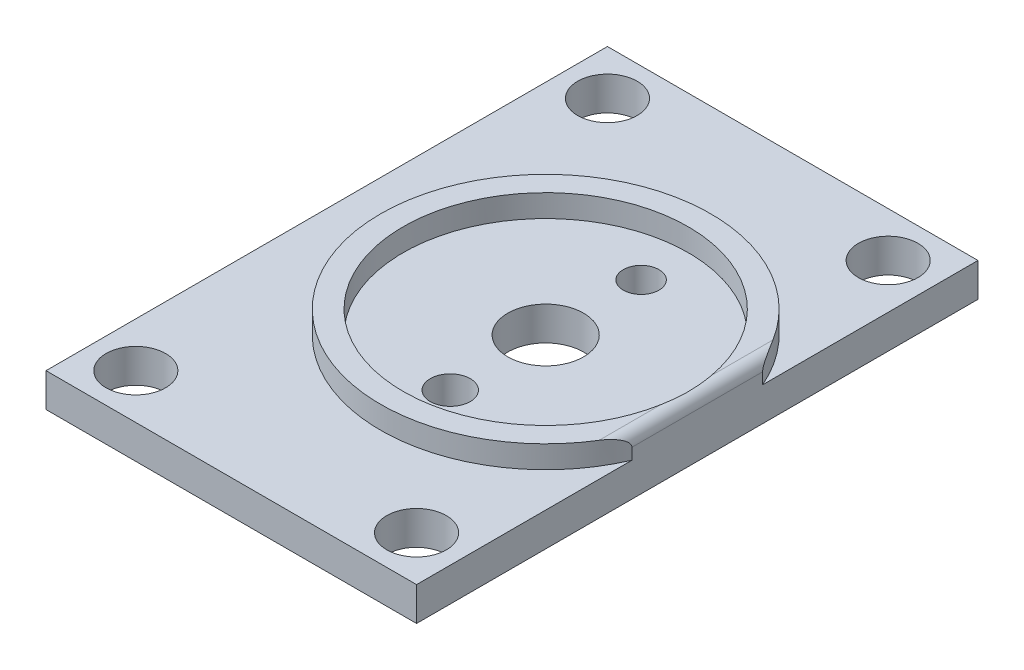
ISO-10303-21;
HEADER;
FILE_DESCRIPTION(('STEP AP214'),'2;1');
FILE_NAME('part.step','',(''),(''),'','','');
FILE_SCHEMA(('AUTOMOTIVE_DESIGN { 1 0 10303 214 1 1 1 1 }'));
ENDSEC;
DATA;
#1=APPLICATION_CONTEXT('core data for automotive mechanical design processes');
#2=APPLICATION_PROTOCOL_DEFINITION('international standard','automotive_design',2000,#1);
#3=PRODUCT_CONTEXT('',#1,'mechanical');
#4=PRODUCT('Part','Part','',(#3));
#5=PRODUCT_RELATED_PRODUCT_CATEGORY('part','',(#4));
#6=PRODUCT_DEFINITION_FORMATION('','',#4);
#7=PRODUCT_DEFINITION_CONTEXT('part definition',#1,'design');
#8=PRODUCT_DEFINITION('design','',#6,#7);
#9=PRODUCT_DEFINITION_SHAPE('','',#8);
#10=(LENGTH_UNIT() NAMED_UNIT(*) SI_UNIT(.MILLI.,.METRE.));
#11=(NAMED_UNIT(*) PLANE_ANGLE_UNIT() SI_UNIT($,.RADIAN.));
#12=(NAMED_UNIT(*) SI_UNIT($,.STERADIAN.) SOLID_ANGLE_UNIT());
#13=UNCERTAINTY_MEASURE_WITH_UNIT(LENGTH_MEASURE(1.E-05),#10,'distance_accuracy_value','');
#14=(GEOMETRIC_REPRESENTATION_CONTEXT(3) GLOBAL_UNCERTAINTY_ASSIGNED_CONTEXT((#13)) GLOBAL_UNIT_ASSIGNED_CONTEXT((#10,
#11,#12)) REPRESENTATION_CONTEXT('',''));
#15=CARTESIAN_POINT('',(0.,0.,0.));
#16=DIRECTION('',(0.,0.,1.));
#17=DIRECTION('',(1.,0.,0.));
#18=AXIS2_PLACEMENT_3D('',#15,#16,#17);
#19=CARTESIAN_POINT('',(0.,3.,0.));
#20=DIRECTION('',(0.,1.,0.));
#21=DIRECTION('',(0.,0.,1.));
#22=AXIS2_PLACEMENT_3D('',#19,#20,#21);
#23=PLANE('',#22);
#24=CARTESIAN_POINT('',(1.27695167286245,3.,-19.8847583643123));
#25=DIRECTION('',(0.,1.,0.));
#26=DIRECTION('',(0.,0.,1.));
#27=AXIS2_PLACEMENT_3D('',#24,#25,#26);
#28=CIRCLE('',#27,1.58978016760219);
#29=CARTESIAN_POINT('',(1.27695167286245,3.,-18.2949781967101));
#30=VERTEX_POINT('',#29);
#31=EDGE_CURVE('E253',#30,#30,#28,.T.);
#32=ORIENTED_EDGE('',*,*,#31,.F.);
#33=EDGE_LOOP('',(#32));
#34=FACE_BOUND('',#33,.T.);
#35=CARTESIAN_POINT('',(1.27695167286245,3.,-2.88475836431227));
#36=DIRECTION('',(0.,1.,0.));
#37=DIRECTION('',(0.,0.,1.));
#38=AXIS2_PLACEMENT_3D('',#35,#36,#37);
#39=CIRCLE('',#38,1.77742826201975);
#40=CARTESIAN_POINT('',(1.27695167286245,3.,-1.10733010229252));
#41=VERTEX_POINT('',#40);
#42=EDGE_CURVE('E257',#41,#41,#39,.T.);
#43=ORIENTED_EDGE('',*,*,#42,.F.);
#44=EDGE_LOOP('',(#43));
#45=FACE_BOUND('',#44,.T.);
#46=CARTESIAN_POINT('',(1.27695167286245,3.,-11.3847583643123));
#47=DIRECTION('',(0.,1.,0.));
#48=DIRECTION('',(0.,0.,1.));
#49=AXIS2_PLACEMENT_3D('',#46,#47,#48);
#50=CIRCLE('',#49,3.375);
#51=CARTESIAN_POINT('',(1.27695167286245,3.,-8.00975836431227));
#52=VERTEX_POINT('',#51);
#53=EDGE_CURVE('E151',#52,#52,#50,.T.);
#54=ORIENTED_EDGE('',*,*,#53,.F.);
#55=EDGE_LOOP('',(#54));
#56=FACE_BOUND('',#55,.T.);
#57=CARTESIAN_POINT('',(1.27695167286245,3.,-11.3847583643123));
#58=DIRECTION('',(0.,1.,0.));
#59=DIRECTION('',(0.,0.,1.));
#60=AXIS2_PLACEMENT_3D('',#57,#58,#59);
#61=CIRCLE('',#60,12.7);
#62=CARTESIAN_POINT('',(1.27695167286245,3.,1.31524163568773));
#63=VERTEX_POINT('',#62);
#64=EDGE_CURVE('E262',#63,#63,#61,.T.);
#65=ORIENTED_EDGE('',*,*,#64,.T.);
#66=EDGE_LOOP('',(#65));
#67=FACE_BOUND('',#66,.T.);
#68=ADVANCED_FACE('F41',(#34,#45,#56,#67),#23,.T.);
#69=CARTESIAN_POINT('',(0.,0.,0.));
#70=DIRECTION('',(0.,1.,0.));
#71=DIRECTION('',(0.,0.,1.));
#72=AXIS2_PLACEMENT_3D('',#69,#70,#71);
#73=PLANE('',#72);
#74=CARTESIAN_POINT('',(1.27695167286245,0.,-19.8847583643123));
#75=DIRECTION('',(0.,1.,0.));
#76=DIRECTION('',(0.,0.,1.));
#77=AXIS2_PLACEMENT_3D('',#74,#75,#76);
#78=CIRCLE('',#77,1.58978016760219);
#79=CARTESIAN_POINT('',(1.27695167286245,0.,-18.2949781967101));
#80=VERTEX_POINT('',#79);
#81=EDGE_CURVE('E266',#80,#80,#78,.T.);
#82=ORIENTED_EDGE('',*,*,#81,.T.);
#83=EDGE_LOOP('',(#82));
#84=FACE_BOUND('',#83,.T.);
#85=CARTESIAN_POINT('',(1.27695167286245,0.,-2.88475836431227));
#86=DIRECTION('',(0.,1.,0.));
#87=DIRECTION('',(0.,0.,1.));
#88=AXIS2_PLACEMENT_3D('',#85,#86,#87);
#89=CIRCLE('',#88,1.77742826201975);
#90=CARTESIAN_POINT('',(1.27695167286245,0.,-1.10733010229252));
#91=VERTEX_POINT('',#90);
#92=EDGE_CURVE('E274',#91,#91,#89,.T.);
#93=ORIENTED_EDGE('',*,*,#92,.T.);
#94=EDGE_LOOP('',(#93));
#95=FACE_BOUND('',#94,.T.);
#96=CARTESIAN_POINT('',(10.7769516728624,0.,-32.3847583643123));
#97=DIRECTION('',(0.,1.,0.));
#98=DIRECTION('',(0.,0.,1.));
#99=AXIS2_PLACEMENT_3D('',#96,#97,#98);
#100=CIRCLE('',#99,2.65);
#101=CARTESIAN_POINT('',(10.7769516728624,0.,-29.7347583643123));
#102=VERTEX_POINT('',#101);
#103=EDGE_CURVE('E297',#102,#102,#100,.F.);
#104=ORIENTED_EDGE('',*,*,#103,.F.);
#105=EDGE_LOOP('',(#104));
#106=FACE_BOUND('',#105,.T.);
#107=CARTESIAN_POINT('',(10.7769516728625,0.,9.61524163568773));
#108=DIRECTION('',(0.,1.,0.));
#109=DIRECTION('',(0.,0.,1.));
#110=AXIS2_PLACEMENT_3D('',#107,#108,#109);
#111=CIRCLE('',#110,2.65);
#112=CARTESIAN_POINT('',(10.7769516728625,0.,12.2652416356877));
#113=VERTEX_POINT('',#112);
#114=EDGE_CURVE('E290',#113,#113,#111,.F.);
#115=ORIENTED_EDGE('',*,*,#114,.F.);
#116=EDGE_LOOP('',(#115));
#117=FACE_BOUND('',#116,.T.);
#118=CARTESIAN_POINT('',(1.27695167286245,0.,-11.3847583643123));
#119=DIRECTION('',(0.,1.,0.));
#120=DIRECTION('',(0.,0.,1.));
#121=AXIS2_PLACEMENT_3D('',#118,#119,#120);
#122=CIRCLE('',#121,3.375);
#123=CARTESIAN_POINT('',(1.27695167286245,0.,-8.00975836431227));
#124=VERTEX_POINT('',#123);
#125=EDGE_CURVE('E150',#124,#124,#122,.T.);
#126=ORIENTED_EDGE('',*,*,#125,.T.);
#127=EDGE_LOOP('',(#126));
#128=FACE_BOUND('',#127,.T.);
#129=DIRECTION('',(1.,0.,0.));
#130=VECTOR('',#129,1.);
#131=CARTESIAN_POINT('',(-10.2230483271375,0.,13.6152416356877));
#132=LINE('',#131,#130);
#133=CARTESIAN_POINT('',(-18.2230483271375,0.,13.6152416356877));
#134=VERTEX_POINT('',#133);
#135=CARTESIAN_POINT('',(14.7769516728625,0.,13.6152416356877));
#136=VERTEX_POINT('',#135);
#137=EDGE_CURVE('E127',#134,#136,#132,.T.);
#138=ORIENTED_EDGE('',*,*,#137,.F.);
#139=DIRECTION('',(0.,0.,1.));
#140=VECTOR('',#139,1.);
#141=CARTESIAN_POINT('',(-18.2230483271375,0.,-36.3847583643123));
#142=LINE('',#141,#140);
#143=CARTESIAN_POINT('',(-18.2230483271375,0.,-36.3847583643123));
#144=VERTEX_POINT('',#143);
#145=EDGE_CURVE('E124',#144,#134,#142,.T.);
#146=ORIENTED_EDGE('',*,*,#145,.F.);
#147=DIRECTION('',(-1.,0.,0.));
#148=VECTOR('',#147,1.);
#149=CARTESIAN_POINT('',(-10.2230483271376,0.,-36.3847583643123));
#150=LINE('',#149,#148);
#151=CARTESIAN_POINT('',(14.7769516728625,0.,-36.3847583643123));
#152=VERTEX_POINT('',#151);
#153=EDGE_CURVE('E109',#152,#144,#150,.T.);
#154=ORIENTED_EDGE('',*,*,#153,.F.);
#155=DIRECTION('',(0.,0.,-1.));
#156=VECTOR('',#155,1.);
#157=CARTESIAN_POINT('',(14.7769516728625,0.,-36.3847583643123));
#158=LINE('',#157,#156);
#159=EDGE_CURVE('E121',#136,#152,#158,.T.);
#160=ORIENTED_EDGE('',*,*,#159,.F.);
#161=EDGE_LOOP('',(#138,#146,#154,#160));
#162=FACE_BOUND('',#161,.T.);
#163=CARTESIAN_POINT('',(-14.2230483271375,0.,-32.3847583643123));
#164=DIRECTION('',(0.,1.,0.));
#165=DIRECTION('',(0.,0.,1.));
#166=AXIS2_PLACEMENT_3D('',#163,#164,#165);
#167=CIRCLE('',#166,2.65);
#168=CARTESIAN_POINT('',(-14.2230483271375,0.,-29.7347583643123));
#169=VERTEX_POINT('',#168);
#170=EDGE_CURVE('E46',#169,#169,#167,.F.);
#171=ORIENTED_EDGE('',*,*,#170,.F.);
#172=EDGE_LOOP('',(#171));
#173=FACE_BOUND('',#172,.T.);
#174=CARTESIAN_POINT('',(-14.2230483271375,0.,9.61524163568773));
#175=DIRECTION('',(0.,1.,0.));
#176=DIRECTION('',(0.,0.,1.));
#177=AXIS2_PLACEMENT_3D('',#174,#175,#176);
#178=CIRCLE('',#177,2.65);
#179=CARTESIAN_POINT('',(-14.2230483271375,0.,12.2652416356877));
#180=VERTEX_POINT('',#179);
#181=EDGE_CURVE('E322',#180,#180,#178,.F.);
#182=ORIENTED_EDGE('',*,*,#181,.F.);
#183=EDGE_LOOP('',(#182));
#184=FACE_BOUND('',#183,.T.);
#185=ADVANCED_FACE('F125',(#84,#95,#106,#117,#128,#162,#173,#184),#73,.F.);
#186=CARTESIAN_POINT('',(1.27695167286245,3.,-11.3847583643123));
#187=DIRECTION('',(0.,1.,0.));
#188=DIRECTION('',(0.,0.,1.));
#189=AXIS2_PLACEMENT_3D('',#186,#187,#188);
#190=CIRCLE('',#189,14.7);
#191=CARTESIAN_POINT('',(14.7769516728625,3.,-17.2019741932119));
#192=VERTEX_POINT('',#191);
#193=CARTESIAN_POINT('',(14.7769516728625,3.,-5.56754253541269));
#194=VERTEX_POINT('',#193);
#195=EDGE_CURVE('E265',#192,#194,#190,.T.);
#196=ORIENTED_EDGE('',*,*,#195,.F.);
#197=DIRECTION('',(0.,0.,-1.));
#198=VECTOR('',#197,1.);
#199=CARTESIAN_POINT('',(14.7769516728625,3.,-36.3847583643123));
#200=LINE('',#199,#198);
#201=CARTESIAN_POINT('',(14.7769516728625,3.,-36.3847583643123));
#202=VERTEX_POINT('',#201);
#203=EDGE_CURVE('E160',#192,#202,#200,.T.);
#204=ORIENTED_EDGE('',*,*,#203,.T.);
#205=DIRECTION('',(-1.,0.,0.));
#206=VECTOR('',#205,1.);
#207=CARTESIAN_POINT('',(-10.2230483271376,3.,-36.3847583643123));
#208=LINE('',#207,#206);
#209=CARTESIAN_POINT('',(-18.2230483271376,3.,-36.3847583643123));
#210=VERTEX_POINT('',#209);
#211=EDGE_CURVE('E165',#202,#210,#208,.T.);
#212=ORIENTED_EDGE('',*,*,#211,.T.);
#213=DIRECTION('',(0.,0.,-1.));
#214=VECTOR('',#213,1.);
#215=CARTESIAN_POINT('',(-18.2230483271376,3.,-36.3847583643123));
#216=LINE('',#215,#214);
#217=CARTESIAN_POINT('',(-18.2230483271375,3.,13.6152416356877));
#218=VERTEX_POINT('',#217);
#219=EDGE_CURVE('E135',#218,#210,#216,.T.);
#220=ORIENTED_EDGE('',*,*,#219,.F.);
#221=DIRECTION('',(1.,0.,0.));
#222=VECTOR('',#221,1.);
#223=CARTESIAN_POINT('',(-10.2230483271375,3.,13.6152416356877));
#224=LINE('',#223,#222);
#225=CARTESIAN_POINT('',(14.7769516728625,3.,13.6152416356877));
#226=VERTEX_POINT('',#225);
#227=EDGE_CURVE('E120',#218,#226,#224,.T.);
#228=ORIENTED_EDGE('',*,*,#227,.T.);
#229=EDGE_CURVE('E161',#226,#194,#200,.T.);
#230=ORIENTED_EDGE('',*,*,#229,.T.);
#231=EDGE_LOOP('',(#196,#204,#212,#220,#228,#230));
#232=FACE_BOUND('',#231,.T.);
#233=CARTESIAN_POINT('',(10.7769516728624,3.,-32.3847583643123));
#234=DIRECTION('',(0.,-1.,0.));
#235=DIRECTION('',(0.,0.,1.));
#236=AXIS2_PLACEMENT_3D('',#233,#234,#235);
#237=CIRCLE('',#236,2.65);
#238=CARTESIAN_POINT('',(10.7769516728624,3.,-29.7347583643123));
#239=VERTEX_POINT('',#238);
#240=EDGE_CURVE('E286',#239,#239,#237,.T.);
#241=ORIENTED_EDGE('',*,*,#240,.T.);
#242=EDGE_LOOP('',(#241));
#243=FACE_BOUND('',#242,.T.);
#244=CARTESIAN_POINT('',(10.7769516728625,3.,9.61524163568773));
#245=DIRECTION('',(0.,-1.,0.));
#246=DIRECTION('',(0.,0.,1.));
#247=AXIS2_PLACEMENT_3D('',#244,#245,#246);
#248=CIRCLE('',#247,2.65);
#249=CARTESIAN_POINT('',(10.7769516728625,3.,12.2652416356877));
#250=VERTEX_POINT('',#249);
#251=EDGE_CURVE('E285',#250,#250,#248,.T.);
#252=ORIENTED_EDGE('',*,*,#251,.T.);
#253=EDGE_LOOP('',(#252));
#254=FACE_BOUND('',#253,.T.);
#255=CARTESIAN_POINT('',(-14.2230483271375,3.,-32.3847583643123));
#256=DIRECTION('',(0.,1.,0.));
#257=DIRECTION('',(0.,0.,1.));
#258=AXIS2_PLACEMENT_3D('',#255,#256,#257);
#259=CIRCLE('',#258,2.65);
#260=CARTESIAN_POINT('',(-14.2230483271375,3.,-29.7347583643123));
#261=VERTEX_POINT('',#260);
#262=EDGE_CURVE('E138',#261,#261,#259,.T.);
#263=ORIENTED_EDGE('',*,*,#262,.F.);
#264=EDGE_LOOP('',(#263));
#265=FACE_BOUND('',#264,.T.);
#266=CARTESIAN_POINT('',(-14.2230483271375,3.,9.61524163568773));
#267=DIRECTION('',(0.,1.,0.));
#268=DIRECTION('',(0.,0.,1.));
#269=AXIS2_PLACEMENT_3D('',#266,#267,#268);
#270=CIRCLE('',#269,2.65);
#271=CARTESIAN_POINT('',(-14.2230483271375,3.,12.2652416356877));
#272=VERTEX_POINT('',#271);
#273=EDGE_CURVE('E144',#272,#272,#270,.T.);
#274=ORIENTED_EDGE('',*,*,#273,.F.);
#275=EDGE_LOOP('',(#274));
#276=FACE_BOUND('',#275,.T.);
#277=ADVANCED_FACE('F230',(#232,#243,#254,#265,#276),#23,.T.);
#278=CARTESIAN_POINT('',(-10.2230483271375,3.,13.6152416356877));
#279=DIRECTION('',(0.,0.,-1.));
#280=DIRECTION('',(-1.,0.,0.));
#281=AXIS2_PLACEMENT_3D('',#278,#279,#280);
#282=PLANE('',#281);
#283=DIRECTION('',(0.,1.,0.));
#284=VECTOR('',#283,1.);
#285=CARTESIAN_POINT('',(-18.2230483271375,3.,13.6152416356877));
#286=LINE('',#285,#284);
#287=EDGE_CURVE('E137',#134,#218,#286,.T.);
#288=ORIENTED_EDGE('',*,*,#287,.F.);
#289=ORIENTED_EDGE('',*,*,#137,.T.);
#290=DIRECTION('',(0.,-1.,0.));
#291=VECTOR('',#290,1.);
#292=CARTESIAN_POINT('',(14.7769516728625,3.,13.6152416356877));
#293=LINE('',#292,#291);
#294=EDGE_CURVE('E174',#226,#136,#293,.T.);
#295=ORIENTED_EDGE('',*,*,#294,.F.);
#296=ORIENTED_EDGE('',*,*,#227,.F.);
#297=EDGE_LOOP('',(#288,#289,#295,#296));
#298=FACE_BOUND('',#297,.T.);
#299=ADVANCED_FACE('F233',(#298),#282,.F.);
#300=CARTESIAN_POINT('',(14.7769516728625,3.,-36.3847583643123));
#301=DIRECTION('',(-1.,0.,0.));
#302=DIRECTION('',(0.,0.,1.));
#303=AXIS2_PLACEMENT_3D('',#300,#301,#302);
#304=PLANE('',#303);
#305=DIRECTION('',(0.,-1.,0.));
#306=VECTOR('',#305,1.);
#307=CARTESIAN_POINT('',(14.7769516728625,5.,-17.2019741932119));
#308=LINE('',#307,#306);
#309=CARTESIAN_POINT('',(14.7769516728625,4.,-17.2019741932119));
#310=VERTEX_POINT('',#309);
#311=EDGE_CURVE('E282',#310,#192,#308,.T.);
#312=ORIENTED_EDGE('',*,*,#311,.F.);
#313=DIRECTION('',(0.,0.,-1.));
#314=VECTOR('',#313,1.);
#315=CARTESIAN_POINT('',(14.7769516728625,4.,-5.56754253541269));
#316=LINE('',#315,#314);
#317=CARTESIAN_POINT('',(14.7769516728625,4.,-5.56754253541269));
#318=VERTEX_POINT('',#317);
#319=EDGE_CURVE('E11',#310,#318,#316,.F.);
#320=ORIENTED_EDGE('',*,*,#319,.T.);
#321=DIRECTION('',(0.,-1.,0.));
#322=VECTOR('',#321,1.);
#323=CARTESIAN_POINT('',(14.7769516728625,5.,-5.56754253541269));
#324=LINE('',#323,#322);
#325=EDGE_CURVE('E279',#318,#194,#324,.T.);
#326=ORIENTED_EDGE('',*,*,#325,.T.);
#327=ORIENTED_EDGE('',*,*,#229,.F.);
#328=ORIENTED_EDGE('',*,*,#294,.T.);
#329=ORIENTED_EDGE('',*,*,#159,.T.);
#330=DIRECTION('',(0.,-1.,0.));
#331=VECTOR('',#330,1.);
#332=CARTESIAN_POINT('',(14.7769516728625,3.,-36.3847583643123));
#333=LINE('',#332,#331);
#334=EDGE_CURVE('E116',#202,#152,#333,.T.);
#335=ORIENTED_EDGE('',*,*,#334,.F.);
#336=ORIENTED_EDGE('',*,*,#203,.F.);
#337=EDGE_LOOP('',(#312,#320,#326,#327,#328,#329,#335,#336));
#338=FACE_BOUND('',#337,.T.);
#339=ADVANCED_FACE('F240',(#338),#304,.F.);
#340=CARTESIAN_POINT('',(-10.2230483271376,3.,-36.3847583643123));
#341=DIRECTION('',(0.,0.,1.));
#342=DIRECTION('',(1.,0.,0.));
#343=AXIS2_PLACEMENT_3D('',#340,#341,#342);
#344=PLANE('',#343);
#345=ORIENTED_EDGE('',*,*,#153,.T.);
#346=DIRECTION('',(0.,-1.,0.));
#347=VECTOR('',#346,1.);
#348=CARTESIAN_POINT('',(-18.2230483271376,3.,-36.3847583643123));
#349=LINE('',#348,#347);
#350=EDGE_CURVE('E114',#210,#144,#349,.T.);
#351=ORIENTED_EDGE('',*,*,#350,.F.);
#352=ORIENTED_EDGE('',*,*,#211,.F.);
#353=ORIENTED_EDGE('',*,*,#334,.T.);
#354=EDGE_LOOP('',(#345,#351,#352,#353));
#355=FACE_BOUND('',#354,.T.);
#356=ADVANCED_FACE('F111',(#355),#344,.F.);
#357=CARTESIAN_POINT('',(1.27695167286245,3.,-11.3847583643123));
#358=DIRECTION('',(0.,-1.,0.));
#359=DIRECTION('',(0.,0.,-1.));
#360=AXIS2_PLACEMENT_3D('',#357,#358,#359);
#361=CYLINDRICAL_SURFACE('',#360,3.375);
#362=ORIENTED_EDGE('',*,*,#53,.T.);
#363=EDGE_LOOP('',(#362));
#364=FACE_BOUND('',#363,.T.);
#365=ORIENTED_EDGE('',*,*,#125,.F.);
#366=EDGE_LOOP('',(#365));
#367=FACE_BOUND('',#366,.T.);
#368=ADVANCED_FACE('F226',(#364,#367),#361,.F.);
#369=CARTESIAN_POINT('',(-18.2230483271375,0.,0.));
#370=DIRECTION('',(-1.,0.,0.));
#371=DIRECTION('',(0.,0.,1.));
#372=AXIS2_PLACEMENT_3D('',#369,#370,#371);
#373=PLANE('',#372);
#374=ORIENTED_EDGE('',*,*,#145,.T.);
#375=ORIENTED_EDGE('',*,*,#287,.T.);
#376=ORIENTED_EDGE('',*,*,#219,.T.);
#377=ORIENTED_EDGE('',*,*,#350,.T.);
#378=EDGE_LOOP('',(#374,#375,#376,#377));
#379=FACE_BOUND('',#378,.T.);
#380=ADVANCED_FACE('F133',(#379),#373,.T.);
#381=CARTESIAN_POINT('',(-14.2230483271375,-0.3,9.61524163568773));
#382=DIRECTION('',(0.,1.,0.));
#383=DIRECTION('',(0.,0.,1.));
#384=AXIS2_PLACEMENT_3D('',#381,#382,#383);
#385=CYLINDRICAL_SURFACE('',#384,2.65);
#386=ORIENTED_EDGE('',*,*,#181,.T.);
#387=EDGE_LOOP('',(#386));
#388=FACE_BOUND('',#387,.T.);
#389=ORIENTED_EDGE('',*,*,#273,.T.);
#390=EDGE_LOOP('',(#389));
#391=FACE_BOUND('',#390,.T.);
#392=ADVANCED_FACE('F219',(#388,#391),#385,.F.);
#393=CARTESIAN_POINT('',(-14.2230483271375,-0.3,-32.3847583643123));
#394=DIRECTION('',(0.,1.,0.));
#395=DIRECTION('',(0.,0.,1.));
#396=AXIS2_PLACEMENT_3D('',#393,#394,#395);
#397=CYLINDRICAL_SURFACE('',#396,2.65);
#398=ORIENTED_EDGE('',*,*,#170,.T.);
#399=EDGE_LOOP('',(#398));
#400=FACE_BOUND('',#399,.T.);
#401=ORIENTED_EDGE('',*,*,#262,.T.);
#402=EDGE_LOOP('',(#401));
#403=FACE_BOUND('',#402,.T.);
#404=ADVANCED_FACE('F215',(#400,#403),#397,.F.);
#405=CARTESIAN_POINT('',(10.7769516728625,-0.3,9.61524163568773));
#406=DIRECTION('',(0.,1.,0.));
#407=DIRECTION('',(0.,0.,1.));
#408=AXIS2_PLACEMENT_3D('',#405,#406,#407);
#409=CYLINDRICAL_SURFACE('',#408,2.65);
#410=ORIENTED_EDGE('',*,*,#251,.F.);
#411=EDGE_LOOP('',(#410));
#412=FACE_BOUND('',#411,.T.);
#413=ORIENTED_EDGE('',*,*,#114,.T.);
#414=EDGE_LOOP('',(#413));
#415=FACE_BOUND('',#414,.T.);
#416=ADVANCED_FACE('F211',(#412,#415),#409,.F.);
#417=CARTESIAN_POINT('',(10.7769516728624,-0.3,-32.3847583643123));
#418=DIRECTION('',(0.,1.,0.));
#419=DIRECTION('',(0.,0.,1.));
#420=AXIS2_PLACEMENT_3D('',#417,#418,#419);
#421=CYLINDRICAL_SURFACE('',#420,2.65);
#422=ORIENTED_EDGE('',*,*,#240,.F.);
#423=EDGE_LOOP('',(#422));
#424=FACE_BOUND('',#423,.T.);
#425=ORIENTED_EDGE('',*,*,#103,.T.);
#426=EDGE_LOOP('',(#425));
#427=FACE_BOUND('',#426,.T.);
#428=ADVANCED_FACE('F205',(#424,#427),#421,.F.);
#429=CARTESIAN_POINT('',(1.27695167286245,5.,-11.3847583643123));
#430=DIRECTION('',(0.,-1.,0.));
#431=DIRECTION('',(0.,0.,-1.));
#432=AXIS2_PLACEMENT_3D('',#429,#430,#431);
#433=CYLINDRICAL_SURFACE('',#432,12.7);
#434=CARTESIAN_POINT('',(1.27695167286245,5.,-11.3847583643123));
#435=DIRECTION('',(0.,1.,0.));
#436=DIRECTION('',(0.,0.,1.));
#437=AXIS2_PLACEMENT_3D('',#434,#435,#436);
#438=CIRCLE('',#437,12.7);
#439=CARTESIAN_POINT('',(13.7769516728625,5.,-13.6297527963766));
#440=VERTEX_POINT('',#439);
#441=CARTESIAN_POINT('',(13.7769516728625,5.,-9.13976393224791));
#442=VERTEX_POINT('',#441);
#443=EDGE_CURVE('E271',#440,#442,#438,.T.);
#444=ORIENTED_EDGE('',*,*,#443,.T.);
#445=CARTESIAN_POINT('',(13.7769516728625,5.,-9.13976393224791));
#446=CARTESIAN_POINT('',(13.7917982648946,4.99999666393264,-9.22242883608441));
#447=CARTESIAN_POINT('',(13.8058241827349,4.99966981555627,-9.30523762198722));
#448=CARTESIAN_POINT('',(13.8322299971182,4.99855905949372,-9.47111282776791));
#449=CARTESIAN_POINT('',(13.8446099229139,4.99777515993167,-9.5541792430403));
#450=CARTESIAN_POINT('',(13.8792729985578,4.99502291514125,-9.80371369877026));
#451=CARTESIAN_POINT('',(13.8990813141116,4.99265397562916,-9.97052734806752));
#452=CARTESIAN_POINT('',(13.9319490481331,4.98805312892272,-10.3036234391423));
#453=CARTESIAN_POINT('',(13.9450552287151,4.9858203707205,-10.4699012877852));
#454=CARTESIAN_POINT('',(13.9647095921097,4.982265656693,-10.8028559893748));
#455=CARTESIAN_POINT('',(13.9712577108323,4.98094370976884,-10.969532846205));
#456=CARTESIAN_POINT('',(13.9785871566708,4.97947302630847,-11.3440895614154));
#457=CARTESIAN_POINT('',(13.9775513656986,4.97969334915199,-11.5520086493808));
#458=CARTESIAN_POINT('',(13.9652751859536,4.98212691271205,-11.9675603732358));
#459=CARTESIAN_POINT('',(13.9540336743221,4.98434037271823,-12.1751929750881));
#460=CARTESIAN_POINT('',(13.9294696825212,4.98833327170211,-12.486931647102));
#461=CARTESIAN_POINT('',(13.9199386892982,4.98978427249376,-12.591354412072));
#462=CARTESIAN_POINT('',(13.8982935093669,4.99267134051921,-12.7999341621755));
#463=CARTESIAN_POINT('',(13.8861793302054,4.99410740779664,-12.9040911480846));
#464=CARTESIAN_POINT('',(13.8593761247133,4.99668878187041,-13.1120644593689));
#465=CARTESIAN_POINT('',(13.8446874005908,4.99783412275453,-13.2158808232718));
#466=CARTESIAN_POINT('',(13.8127427272464,4.99948463129596,-13.4231246441708));
#467=CARTESIAN_POINT('',(13.7954867279227,4.99998978645787,-13.5265520935365));
#468=CARTESIAN_POINT('',(13.7769516728625,5.,-13.6297527963766));
#469=B_SPLINE_CURVE_WITH_KNOTS('',3,(#445,#446,#447,#448,#449,#450,#451,#452,#453,#454,#455,
#456,#457,#458,#459,#460,#461,#462,#463,#464,#465,#466,#467,#468),.UNSPECIFIED.,.F.,.F.,(4,2,2,
2,2,2,2,2,2,2,2,4),(0.,0.251951724219675,0.503898970110917,1.0077617893011,1.50805937515915,
2.00836185023315,2.63186235615105,3.2554314694485,3.57000566075406,3.88457893303305,
4.19911530442203,4.51365781496104),.UNSPECIFIED.);
#470=EDGE_CURVE('E185',#442,#440,#469,.T.);
#471=ORIENTED_EDGE('',*,*,#470,.T.);
#472=EDGE_LOOP('',(#444,#471));
#473=FACE_BOUND('',#472,.T.);
#474=ORIENTED_EDGE('',*,*,#64,.F.);
#475=EDGE_LOOP('',(#474));
#476=FACE_BOUND('',#475,.T.);
#477=ADVANCED_FACE('F200',(#473,#476),#433,.F.);
#478=CARTESIAN_POINT('',(1.27695167286245,5.,-11.3847583643123));
#479=DIRECTION('',(0.,-1.,0.));
#480=DIRECTION('',(0.,0.,-1.));
#481=AXIS2_PLACEMENT_3D('',#478,#479,#480);
#482=CYLINDRICAL_SURFACE('',#481,14.7);
#483=CARTESIAN_POINT('',(1.27695167286245,5.,-11.3847583643123));
#484=DIRECTION('',(0.,1.,0.));
#485=DIRECTION('',(0.,0.,1.));
#486=AXIS2_PLACEMENT_3D('',#483,#484,#485);
#487=CIRCLE('',#486,14.7);
#488=CARTESIAN_POINT('',(13.7769516728625,5.,-19.1203902066378));
#489=VERTEX_POINT('',#488);
#490=CARTESIAN_POINT('',(13.7769516728625,5.,-3.64912652198679));
#491=VERTEX_POINT('',#490);
#492=EDGE_CURVE('E276',#489,#491,#487,.T.);
#493=ORIENTED_EDGE('',*,*,#492,.F.);
#494=CARTESIAN_POINT('',(13.7769516728625,5.,-19.1203902066378));
#495=CARTESIAN_POINT('',(13.804852368223,4.9999954869858,-19.0753061888042));
#496=CARTESIAN_POINT('',(13.832502937192,4.99883293515778,-19.0300797188275));
#497=CARTESIAN_POINT('',(13.8872628706643,4.99427760957824,-18.9394161721947));
#498=CARTESIAN_POINT('',(13.9143722777845,4.9908850121644,-18.8939791124727));
#499=CARTESIAN_POINT('',(13.9949206253484,4.97747619195145,-18.7573055899291));
#500=CARTESIAN_POINT('',(14.0474892285777,4.96422949908699,-18.6658530078683));
#501=CARTESIAN_POINT('',(14.1492391259875,4.92964922229002,-18.484398319347));
#502=CARTESIAN_POINT('',(14.1984584085419,4.90843534248119,-18.3943943606808));
#503=CARTESIAN_POINT('',(14.2940184721401,4.85765630451537,-18.215295886609));
#504=CARTESIAN_POINT('',(14.3403623000959,4.82810017697294,-18.1262004951361));
#505=CARTESIAN_POINT('',(14.4133219773777,4.7722005267082,-17.9824611845864));
#506=CARTESIAN_POINT('',(14.4409190458115,4.74868073896599,-17.9272104270308));
#507=CARTESIAN_POINT('',(14.4948416459913,4.69716517838304,-17.817575200898));
#508=CARTESIAN_POINT('',(14.5211567033167,4.66913867397831,-17.7631997231175));
#509=CARTESIAN_POINT('',(14.5637646785544,4.61777688642314,-17.6738125008723));
#510=CARTESIAN_POINT('',(14.5805473185861,4.59585416926962,-17.6382237395724));
#511=CARTESIAN_POINT('',(14.6131471571876,4.54917205554668,-17.5683958889449));
#512=CARTESIAN_POINT('',(14.6289631897218,4.52440933267153,-17.5341584467005));
#513=CARTESIAN_POINT('',(14.6592067346695,4.47174300492469,-17.4680599708097));
#514=CARTESIAN_POINT('',(14.673645271814,4.44386905591497,-17.4361806273127));
#515=CARTESIAN_POINT('',(14.7008163294829,4.38412106538178,-17.3756637382121));
#516=CARTESIAN_POINT('',(14.713553949372,4.35225956163003,-17.3470165445615));
#517=CARTESIAN_POINT('',(14.7324305007182,4.2959679762253,-17.3042539558129));
#518=CARTESIAN_POINT('',(14.7392995684892,4.27295905041984,-17.2886069801691));
#519=CARTESIAN_POINT('',(14.751674598352,4.22479253232095,-17.2603076781505));
#520=CARTESIAN_POINT('',(14.7571814576979,4.19963636913021,-17.2476533808126));
#521=CARTESIAN_POINT('',(14.7656840546325,4.15136900747075,-17.2280618159638));
#522=CARTESIAN_POINT('',(14.7689364224677,4.12854313994863,-17.2205430785036));
#523=CARTESIAN_POINT('',(14.7738684475927,4.08186303400441,-17.2091277885398));
#524=CARTESIAN_POINT('',(14.7755523157903,4.058011729921,-17.2052215378958));
#525=CARTESIAN_POINT('',(14.7767604298796,4.02268622155709,-17.202417806813));
#526=CARTESIAN_POINT('',(14.7769559862048,4.01134201920128,-17.2019636177184));
#527=CARTESIAN_POINT('',(14.7769516728625,4.,-17.2019741932119));
#528=B_SPLINE_CURVE_WITH_KNOTS('',3,(#494,#495,#496,#497,#498,#499,#500,#501,#502,#503,#504,
#505,#506,#507,#508,#509,#510,#511,#512,#513,#514,#515,#516,#517,#518,#519,#520,#521,#522,#523,
#524,#525,#526,#527),.UNSPECIFIED.,.F.,.F.,(4,2,2,2,2,2,2,2,2,2,2,2,2,2,2,2,4),(0.,
0.159024980973563,0.318037388786538,0.636576370945678,0.950509358150242,1.26410380281102,
1.46223860105219,1.66178674466198,1.79682354994621,1.93202016169716,2.06602332169286,
2.19961525973189,2.28539772771844,2.37112354147929,2.44359284038567,2.51586701742765,
2.54989177646313),.UNSPECIFIED.);
#529=EDGE_CURVE('E52',#489,#310,#528,.T.);
#530=ORIENTED_EDGE('',*,*,#529,.T.);
#531=ORIENTED_EDGE('',*,*,#311,.T.);
#532=ORIENTED_EDGE('',*,*,#195,.T.);
#533=ORIENTED_EDGE('',*,*,#325,.F.);
#534=CARTESIAN_POINT('',(14.7769516728625,4.,-5.56754253541269));
#535=CARTESIAN_POINT('',(14.7769798518988,4.02508472034533,-5.56761243459964));
#536=CARTESIAN_POINT('',(14.7760092835958,4.05006458511525,-5.56535528123019));
#537=CARTESIAN_POINT('',(14.7723404109595,4.09887928973539,-5.55684990943588));
#538=CARTESIAN_POINT('',(14.7696650287718,4.1227248766999,-5.5506546437256));
#539=CARTESIAN_POINT('',(14.7619269452442,4.17525286383017,-5.53278839792091));
#540=CARTESIAN_POINT('',(14.7564157765521,4.20351195595343,-5.52009303598014));
#541=CARTESIAN_POINT('',(14.7436115535946,4.25757530833313,-5.49075020211459));
#542=CARTESIAN_POINT('',(14.7363085276445,4.28336466761049,-5.47408062893565));
#543=CARTESIAN_POINT('',(14.7147915949918,4.34986961273874,-5.42526399701179));
#544=CARTESIAN_POINT('',(14.6993430879138,4.38824106355493,-5.39050895249528));
#545=CARTESIAN_POINT('',(14.6661177265775,4.45926087093653,-5.3166536861603));
#546=CARTESIAN_POINT('',(14.6483356752208,4.49189606092934,-5.27754379590936));
#547=CARTESIAN_POINT('',(14.6099645917568,4.5545434761858,-5.19420107422975));
#548=CARTESIAN_POINT('',(14.5892696013558,4.58426447822653,-5.14980083877377));
#549=CARTESIAN_POINT('',(14.5464392379021,4.63961924897627,-5.0591579118229));
#550=CARTESIAN_POINT('',(14.5243023776408,4.66524870038364,-5.01291333767695));
#551=CARTESIAN_POINT('',(14.4787449739834,4.71314952252371,-4.91904983095133));
#552=CARTESIAN_POINT('',(14.455319369279,4.73540614051953,-4.87142588771329));
#553=CARTESIAN_POINT('',(14.4074270986078,4.7768536532526,-4.77540919531009));
#554=CARTESIAN_POINT('',(14.3829607425843,4.79604545273199,-4.72701667768519));
#555=CARTESIAN_POINT('',(14.3141297776397,4.84519527199521,-4.59276120141797));
#556=CARTESIAN_POINT('',(14.2687613145388,4.87226422372073,-4.50634519875303));
#557=CARTESIAN_POINT('',(14.175394471584,4.91867144936574,-4.33281515970143));
#558=CARTESIAN_POINT('',(14.1273941603675,4.93800395723063,-4.2457006518526));
#559=CARTESIAN_POINT('',(14.0300633469034,4.96875339310511,-4.07327909627499));
#560=CARTESIAN_POINT('',(13.9807823797233,4.98032893967164,-3.9879727499118));
#561=CARTESIAN_POINT('',(13.9053879481181,4.99204271206993,-3.86046200857633));
#562=CARTESIAN_POINT('',(13.8800257120169,4.99500563001926,-3.81805704559709));
#563=CARTESIAN_POINT('',(13.8288320653197,4.99898261568122,-3.73343525330129));
#564=CARTESIAN_POINT('',(13.8030006172307,4.99999652695852,-3.69121843935764));
#565=CARTESIAN_POINT('',(13.7769516728625,5.,-3.64912652198679));
#566=B_SPLINE_CURVE_WITH_KNOTS('',3,(#534,#535,#536,#537,#538,#539,#540,#541,#542,#543,#544,
#545,#546,#547,#548,#549,#550,#551,#552,#553,#554,#555,#556,#557,#558,#559,#560,#561,#562,#563,
#564,#565),.UNSPECIFIED.,.F.,.F.,(4,2,2,2,2,2,2,2,2,2,2,2,2,2,2,4),(0.,0.0749653757653962,
0.148943478130678,0.242811691648729,0.337214626075225,0.498387562477841,0.659925744441139,
0.831555403665578,1.00336498199469,1.17590561400697,1.3483952170576,1.65184760098335,
1.95552573187475,2.25278740598212,2.40125065292326,2.54972581564212),.UNSPECIFIED.);
#567=EDGE_CURVE('E193',#318,#491,#566,.T.);
#568=ORIENTED_EDGE('',*,*,#567,.T.);
#569=EDGE_LOOP('',(#493,#530,#531,#532,#533,#568));
#570=FACE_BOUND('',#569,.T.);
#571=ADVANCED_FACE('F204',(#570),#482,.T.);
#572=CARTESIAN_POINT('',(0.,5.,0.));
#573=DIRECTION('',(0.,1.,0.));
#574=DIRECTION('',(0.,0.,1.));
#575=AXIS2_PLACEMENT_3D('',#572,#573,#574);
#576=PLANE('',#575);
#577=ORIENTED_EDGE('',*,*,#492,.T.);
#578=DIRECTION('',(0.,0.,-1.));
#579=VECTOR('',#578,1.);
#580=CARTESIAN_POINT('',(13.7769516728625,5.,-17.2019741932119));
#581=LINE('',#580,#579);
#582=EDGE_CURVE('E181',#491,#442,#581,.T.);
#583=ORIENTED_EDGE('',*,*,#582,.T.);
#584=ORIENTED_EDGE('',*,*,#443,.F.);
#585=DIRECTION('',(0.,0.,-1.));
#586=VECTOR('',#585,1.);
#587=CARTESIAN_POINT('',(13.7769516728625,5.,-17.2019741932119));
#588=LINE('',#587,#586);
#589=EDGE_CURVE('E178',#440,#489,#588,.T.);
#590=ORIENTED_EDGE('',*,*,#589,.T.);
#591=EDGE_LOOP('',(#577,#583,#584,#590));
#592=FACE_BOUND('',#591,.T.);
#593=ADVANCED_FACE('F350',(#592),#576,.T.);
#594=CARTESIAN_POINT('',(13.7769516728625,4.,0.));
#595=DIRECTION('',(0.,0.,1.));
#596=DIRECTION('',(1.,0.,0.));
#597=AXIS2_PLACEMENT_3D('',#594,#595,#596);
#598=CYLINDRICAL_SURFACE('',#597,1.);
#599=ORIENTED_EDGE('',*,*,#567,.F.);
#600=ORIENTED_EDGE('',*,*,#319,.F.);
#601=ORIENTED_EDGE('',*,*,#529,.F.);
#602=ORIENTED_EDGE('',*,*,#589,.F.);
#603=ORIENTED_EDGE('',*,*,#470,.F.);
#604=ORIENTED_EDGE('',*,*,#582,.F.);
#605=EDGE_LOOP('',(#599,#600,#601,#602,#603,#604));
#606=FACE_BOUND('',#605,.T.);
#607=ADVANCED_FACE('F43',(#606),#598,.T.);
#608=CARTESIAN_POINT('',(1.27695167286245,-7.,-2.88475836431227));
#609=DIRECTION('',(0.,1.,0.));
#610=DIRECTION('',(0.,0.,1.));
#611=AXIS2_PLACEMENT_3D('',#608,#609,#610);
#612=CYLINDRICAL_SURFACE('',#611,1.77742826201975);
#613=ORIENTED_EDGE('',*,*,#42,.T.);
#614=EDGE_LOOP('',(#613));
#615=FACE_BOUND('',#614,.T.);
#616=ORIENTED_EDGE('',*,*,#92,.F.);
#617=EDGE_LOOP('',(#616));
#618=FACE_BOUND('',#617,.T.);
#619=ADVANCED_FACE('F353',(#615,#618),#612,.F.);
#620=CARTESIAN_POINT('',(1.27695167286245,-7.,-19.8847583643123));
#621=DIRECTION('',(0.,1.,0.));
#622=DIRECTION('',(0.,0.,1.));
#623=AXIS2_PLACEMENT_3D('',#620,#621,#622);
#624=CYLINDRICAL_SURFACE('',#623,1.58978016760219);
#625=ORIENTED_EDGE('',*,*,#31,.T.);
#626=EDGE_LOOP('',(#625));
#627=FACE_BOUND('',#626,.T.);
#628=ORIENTED_EDGE('',*,*,#81,.F.);
#629=EDGE_LOOP('',(#628));
#630=FACE_BOUND('',#629,.T.);
#631=ADVANCED_FACE('F358',(#627,#630),#624,.F.);
#632=CLOSED_SHELL('',(#68,#185,#277,#299,#339,#356,#368,#380,#392,#404,#416,#428,#477,#571,#593,
#607,#619,#631));
#633=MANIFOLD_SOLID_BREP('B2',#632);
#634=ADVANCED_BREP_SHAPE_REPRESENTATION('',(#18,#633),#14);
#635=SHAPE_DEFINITION_REPRESENTATION(#9,#634);
ENDSEC;
END-ISO-10303-21;
